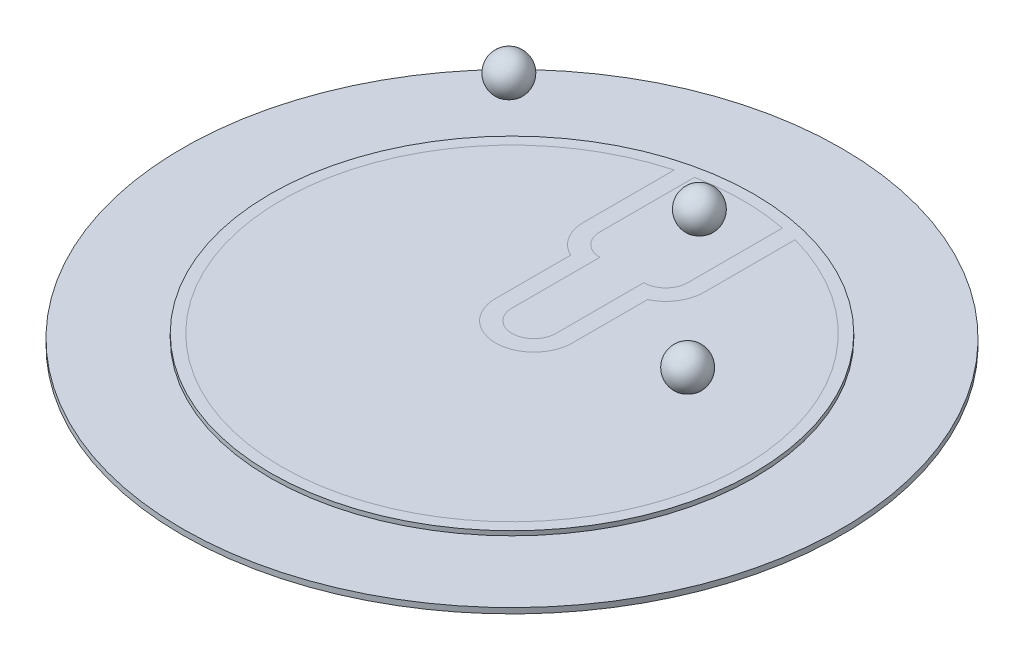
ISO-10303-21;
HEADER;
FILE_DESCRIPTION(('STEP AP214'),'2;1');
FILE_NAME('part.step','',(''),(''),'','','');
FILE_SCHEMA(('AUTOMOTIVE_DESIGN { 1 0 10303 214 1 1 1 1 }'));
ENDSEC;
DATA;
#1=APPLICATION_CONTEXT('core data for automotive mechanical design processes');
#2=APPLICATION_PROTOCOL_DEFINITION('international standard','automotive_design',2000,#1);
#3=PRODUCT_CONTEXT('',#1,'mechanical');
#4=PRODUCT('Part','Part','',(#3));
#5=PRODUCT_RELATED_PRODUCT_CATEGORY('part','',(#4));
#6=PRODUCT_DEFINITION_FORMATION('','',#4);
#7=PRODUCT_DEFINITION_CONTEXT('part definition',#1,'design');
#8=PRODUCT_DEFINITION('design','',#6,#7);
#9=PRODUCT_DEFINITION_SHAPE('','',#8);
#10=(LENGTH_UNIT() NAMED_UNIT(*) SI_UNIT(.MILLI.,.METRE.));
#11=(NAMED_UNIT(*) PLANE_ANGLE_UNIT() SI_UNIT($,.RADIAN.));
#12=(NAMED_UNIT(*) SI_UNIT($,.STERADIAN.) SOLID_ANGLE_UNIT());
#13=UNCERTAINTY_MEASURE_WITH_UNIT(LENGTH_MEASURE(1.E-05),#10,'distance_accuracy_value','');
#14=(GEOMETRIC_REPRESENTATION_CONTEXT(3) GLOBAL_UNCERTAINTY_ASSIGNED_CONTEXT((#13)) GLOBAL_UNIT_ASSIGNED_CONTEXT((#10,
#11,#12)) REPRESENTATION_CONTEXT('',''));
#15=CARTESIAN_POINT('',(0.,0.,0.));
#16=DIRECTION('',(0.,0.,1.));
#17=DIRECTION('',(1.,0.,0.));
#18=AXIS2_PLACEMENT_3D('',#15,#16,#17);
#19=CARTESIAN_POINT('',(5.97028463083582,0.45,-2.02477695580683));
#20=DIRECTION('',(0.,1.,0.));
#21=DIRECTION('',(0.,0.,1.));
#22=AXIS2_PLACEMENT_3D('',#19,#20,#21);
#23=PLANE('',#22);
#24=CARTESIAN_POINT('',(5.97028463083582,0.45,-2.02477695580683));
#25=DIRECTION('',(0.,1.,0.));
#26=DIRECTION('',(0.,0.,1.));
#27=AXIS2_PLACEMENT_3D('',#24,#25,#26);
#28=CIRCLE('',#27,0.6);
#29=CARTESIAN_POINT('',(5.97028463083582,0.45,-1.42477695580683));
#30=VERTEX_POINT('',#29);
#31=EDGE_CURVE('E11',#30,#30,#28,.T.);
#32=ORIENTED_EDGE('',*,*,#31,.F.);
#33=EDGE_LOOP('',(#32));
#34=FACE_BOUND('',#33,.T.);
#35=ADVANCED_FACE('F56',(#34),#23,.F.);
#36=CARTESIAN_POINT('',(5.97028463083582,1.08,-2.02477695580683));
#37=DIRECTION('',(0.,1.,0.));
#38=DIRECTION('',(0.,0.,-1.));
#39=AXIS2_PLACEMENT_3D('',#36,#37,#38);
#40=SPHERICAL_SURFACE('',#39,0.87);
#41=ORIENTED_EDGE('',*,*,#31,.T.);
#42=EDGE_LOOP('',(#41));
#43=FACE_BOUND('',#42,.T.);
#44=ADVANCED_FACE('F63',(#43),#40,.T.);
#45=CLOSED_SHELL('',(#35,#44));
#46=MANIFOLD_SOLID_BREP('B2',#45);
#47=CARTESIAN_POINT('',(0.,0.45,-8.52895660487363));
#48=DIRECTION('',(0.,1.,0.));
#49=DIRECTION('',(0.,0.,1.));
#50=AXIS2_PLACEMENT_3D('',#47,#48,#49);
#51=PLANE('',#50);
#52=CARTESIAN_POINT('',(0.,0.45,-8.52895660487363));
#53=DIRECTION('',(0.,1.,0.));
#54=DIRECTION('',(0.,0.,1.));
#55=AXIS2_PLACEMENT_3D('',#52,#53,#54);
#56=CIRCLE('',#55,0.6);
#57=CARTESIAN_POINT('',(0.,0.45,-7.92895660487363));
#58=VERTEX_POINT('',#57);
#59=EDGE_CURVE('E55',#58,#58,#56,.T.);
#60=ORIENTED_EDGE('',*,*,#59,.F.);
#61=EDGE_LOOP('',(#60));
#62=FACE_BOUND('',#61,.T.);
#63=ADVANCED_FACE('F94',(#62),#51,.F.);
#64=CARTESIAN_POINT('',(0.,1.08,-8.52895660487363));
#65=DIRECTION('',(0.,1.,0.));
#66=DIRECTION('',(0.,0.,-1.));
#67=AXIS2_PLACEMENT_3D('',#64,#65,#66);
#68=SPHERICAL_SURFACE('',#67,0.87);
#69=ORIENTED_EDGE('',*,*,#59,.T.);
#70=EDGE_LOOP('',(#69));
#71=FACE_BOUND('',#70,.T.);
#72=ADVANCED_FACE('F101',(#71),#68,.T.);
#73=CLOSED_SHELL('',(#63,#72));
#74=MANIFOLD_SOLID_BREP('B6',#73);
#75=CARTESIAN_POINT('',(0.,0.45,0.));
#76=DIRECTION('',(0.,1.,0.));
#77=DIRECTION('',(0.,0.,1.));
#78=AXIS2_PLACEMENT_3D('',#75,#76,#77);
#79=PLANE('',#78);
#80=CARTESIAN_POINT('',(0.,0.45,0.));
#81=DIRECTION('',(0.,1.,0.));
#82=DIRECTION('',(0.,0.,1.));
#83=AXIS2_PLACEMENT_3D('',#80,#81,#82);
#84=CIRCLE('',#83,11.);
#85=CARTESIAN_POINT('',(0.,0.45,11.));
#86=VERTEX_POINT('',#85);
#87=EDGE_CURVE('E331',#86,#86,#84,.T.);
#88=ORIENTED_EDGE('',*,*,#87,.T.);
#89=EDGE_LOOP('',(#88));
#90=FACE_BOUND('',#89,.T.);
#91=DIRECTION('',(0.,0.,-1.));
#92=VECTOR('',#91,1.);
#93=CARTESIAN_POINT('',(-2.,0.45,0.));
#94=LINE('',#93,#92);
#95=CARTESIAN_POINT('',(-2.,0.45,-6.));
#96=VERTEX_POINT('',#95);
#97=CARTESIAN_POINT('',(-2.,0.45,-10.3077640640442));
#98=VERTEX_POINT('',#97);
#99=EDGE_CURVE('E217',#96,#98,#94,.T.);
#100=ORIENTED_EDGE('',*,*,#99,.T.);
#101=CARTESIAN_POINT('',(0.,0.45,0.));
#102=DIRECTION('',(0.,1.,0.));
#103=DIRECTION('',(0.,0.,1.));
#104=AXIS2_PLACEMENT_3D('',#101,#102,#103);
#105=CIRCLE('',#104,10.5);
#106=CARTESIAN_POINT('',(2.,0.45,-10.3077640640442));
#107=VERTEX_POINT('',#106);
#108=EDGE_CURVE('E211',#98,#107,#105,.F.);
#109=ORIENTED_EDGE('',*,*,#108,.T.);
#110=DIRECTION('',(0.,0.,1.));
#111=VECTOR('',#110,1.);
#112=CARTESIAN_POINT('',(2.,0.45,0.));
#113=LINE('',#112,#111);
#114=CARTESIAN_POINT('',(2.,0.45,-6.));
#115=VERTEX_POINT('',#114);
#116=EDGE_CURVE('E215',#107,#115,#113,.T.);
#117=ORIENTED_EDGE('',*,*,#116,.T.);
#118=CARTESIAN_POINT('',(1.,0.45,-6.));
#119=DIRECTION('',(0.,1.,0.));
#120=DIRECTION('',(0.,0.,1.));
#121=AXIS2_PLACEMENT_3D('',#118,#119,#120);
#122=CIRCLE('',#121,0.999999999999999);
#123=CARTESIAN_POINT('',(1.,0.45,-5.));
#124=VERTEX_POINT('',#123);
#125=EDGE_CURVE('E223',#115,#124,#122,.F.);
#126=ORIENTED_EDGE('',*,*,#125,.T.);
#127=DIRECTION('',(0.,0.,1.));
#128=VECTOR('',#127,1.);
#129=CARTESIAN_POINT('',(0.999999999999999,0.45,0.));
#130=LINE('',#129,#128);
#131=CARTESIAN_POINT('',(0.999999999999999,0.45,-1.));
#132=VERTEX_POINT('',#131);
#133=EDGE_CURVE('E230',#124,#132,#130,.T.);
#134=ORIENTED_EDGE('',*,*,#133,.T.);
#135=CARTESIAN_POINT('',(0.,0.45,-1.));
#136=DIRECTION('',(0.,1.,0.));
#137=DIRECTION('',(0.,0.,1.));
#138=AXIS2_PLACEMENT_3D('',#135,#136,#137);
#139=CIRCLE('',#138,1.);
#140=CARTESIAN_POINT('',(0.,0.45,0.));
#141=VERTEX_POINT('',#140);
#142=EDGE_CURVE('E241',#132,#141,#139,.F.);
#143=ORIENTED_EDGE('',*,*,#142,.T.);
#144=CARTESIAN_POINT('',(0.,0.45,-1.));
#145=DIRECTION('',(0.,1.,0.));
#146=DIRECTION('',(0.,0.,1.));
#147=AXIS2_PLACEMENT_3D('',#144,#145,#146);
#148=CIRCLE('',#147,1.);
#149=CARTESIAN_POINT('',(-1.,0.45,-1.));
#150=VERTEX_POINT('',#149);
#151=EDGE_CURVE('E245',#141,#150,#148,.F.);
#152=ORIENTED_EDGE('',*,*,#151,.T.);
#153=DIRECTION('',(0.,0.,-1.));
#154=VECTOR('',#153,1.);
#155=CARTESIAN_POINT('',(-0.999999999999999,0.45,0.));
#156=LINE('',#155,#154);
#157=CARTESIAN_POINT('',(-1.,0.45,-5.));
#158=VERTEX_POINT('',#157);
#159=EDGE_CURVE('E249',#150,#158,#156,.T.);
#160=ORIENTED_EDGE('',*,*,#159,.T.);
#161=CARTESIAN_POINT('',(-1.,0.45,-6.));
#162=DIRECTION('',(0.,1.,0.));
#163=DIRECTION('',(0.,0.,1.));
#164=AXIS2_PLACEMENT_3D('',#161,#162,#163);
#165=CIRCLE('',#164,0.999999999999999);
#166=EDGE_CURVE('E253',#158,#96,#165,.F.);
#167=ORIENTED_EDGE('',*,*,#166,.T.);
#168=EDGE_LOOP('',(#100,#109,#117,#126,#134,#143,#152,#160,#167));
#169=FACE_BOUND('',#168,.T.);
#170=DIRECTION('',(0.,0.,-1.));
#171=VECTOR('',#170,1.);
#172=CARTESIAN_POINT('',(2.75,0.45,0.));
#173=LINE('',#172,#171);
#174=CARTESIAN_POINT('',(2.75,0.45,-6.));
#175=VERTEX_POINT('',#174);
#176=CARTESIAN_POINT('',(2.75,0.45,-10.1334840997556));
#177=VERTEX_POINT('',#176);
#178=EDGE_CURVE('E149',#175,#177,#173,.T.);
#179=ORIENTED_EDGE('',*,*,#178,.T.);
#180=CARTESIAN_POINT('',(0.,0.45,0.));
#181=DIRECTION('',(0.,1.,0.));
#182=DIRECTION('',(0.,0.,1.));
#183=AXIS2_PLACEMENT_3D('',#180,#181,#182);
#184=CIRCLE('',#183,10.5);
#185=CARTESIAN_POINT('',(-2.75,0.45,-10.1334840997556));
#186=VERTEX_POINT('',#185);
#187=EDGE_CURVE('E133',#177,#186,#184,.F.);
#188=ORIENTED_EDGE('',*,*,#187,.T.);
#189=DIRECTION('',(0.,0.,1.));
#190=VECTOR('',#189,1.);
#191=CARTESIAN_POINT('',(-2.75,0.45,0.));
#192=LINE('',#191,#190);
#193=CARTESIAN_POINT('',(-2.75,0.45,-6.));
#194=VERTEX_POINT('',#193);
#195=EDGE_CURVE('E220',#186,#194,#192,.T.);
#196=ORIENTED_EDGE('',*,*,#195,.T.);
#197=CARTESIAN_POINT('',(-1.,0.45,-6.));
#198=DIRECTION('',(0.,1.,0.));
#199=DIRECTION('',(0.,0.,1.));
#200=AXIS2_PLACEMENT_3D('',#197,#198,#199);
#201=CIRCLE('',#200,1.75);
#202=CARTESIAN_POINT('',(-1.75,0.45,-4.41886116991581));
#203=VERTEX_POINT('',#202);
#204=EDGE_CURVE('E261',#194,#203,#201,.T.);
#205=ORIENTED_EDGE('',*,*,#204,.T.);
#206=DIRECTION('',(0.,0.,1.));
#207=VECTOR('',#206,1.);
#208=CARTESIAN_POINT('',(-1.75,0.45,0.));
#209=LINE('',#208,#207);
#210=CARTESIAN_POINT('',(-1.75,0.45,-1.));
#211=VERTEX_POINT('',#210);
#212=EDGE_CURVE('E265',#203,#211,#209,.T.);
#213=ORIENTED_EDGE('',*,*,#212,.T.);
#214=CARTESIAN_POINT('',(0.,0.45,-1.));
#215=DIRECTION('',(0.,1.,0.));
#216=DIRECTION('',(0.,0.,1.));
#217=AXIS2_PLACEMENT_3D('',#214,#215,#216);
#218=CIRCLE('',#217,1.75);
#219=CARTESIAN_POINT('',(0.,0.45,0.75));
#220=VERTEX_POINT('',#219);
#221=EDGE_CURVE('E269',#211,#220,#218,.T.);
#222=ORIENTED_EDGE('',*,*,#221,.T.);
#223=CARTESIAN_POINT('',(0.,0.45,-1.));
#224=DIRECTION('',(0.,1.,0.));
#225=DIRECTION('',(0.,0.,1.));
#226=AXIS2_PLACEMENT_3D('',#223,#224,#225);
#227=CIRCLE('',#226,1.75);
#228=CARTESIAN_POINT('',(1.75,0.45,-0.999999999999999));
#229=VERTEX_POINT('',#228);
#230=EDGE_CURVE('E273',#220,#229,#227,.T.);
#231=ORIENTED_EDGE('',*,*,#230,.T.);
#232=DIRECTION('',(0.,0.,-1.));
#233=VECTOR('',#232,1.);
#234=CARTESIAN_POINT('',(1.75,0.45,0.));
#235=LINE('',#234,#233);
#236=CARTESIAN_POINT('',(1.75,0.45,-4.41886116991581));
#237=VERTEX_POINT('',#236);
#238=EDGE_CURVE('E277',#229,#237,#235,.T.);
#239=ORIENTED_EDGE('',*,*,#238,.T.);
#240=CARTESIAN_POINT('',(1.,0.45,-6.));
#241=DIRECTION('',(0.,1.,0.));
#242=DIRECTION('',(0.,0.,1.));
#243=AXIS2_PLACEMENT_3D('',#240,#241,#242);
#244=CIRCLE('',#243,1.75);
#245=EDGE_CURVE('E281',#237,#175,#244,.T.);
#246=ORIENTED_EDGE('',*,*,#245,.T.);
#247=EDGE_LOOP('',(#179,#188,#196,#205,#213,#222,#231,#239,#246));
#248=FACE_BOUND('',#247,.T.);
#249=ADVANCED_FACE('F124',(#90,#169,#248),#79,.T.);
#250=ORIENTED_EDGE('',*,*,#187,.F.);
#251=ORIENTED_EDGE('',*,*,#178,.F.);
#252=ORIENTED_EDGE('',*,*,#245,.F.);
#253=ORIENTED_EDGE('',*,*,#238,.F.);
#254=ORIENTED_EDGE('',*,*,#230,.F.);
#255=ORIENTED_EDGE('',*,*,#221,.F.);
#256=ORIENTED_EDGE('',*,*,#212,.F.);
#257=ORIENTED_EDGE('',*,*,#204,.F.);
#258=ORIENTED_EDGE('',*,*,#195,.F.);
#259=EDGE_LOOP('',(#250,#251,#252,#253,#254,#255,#256,#257,#258));
#260=FACE_BOUND('',#259,.T.);
#261=ADVANCED_FACE('F287',(#260),#79,.T.);
#262=CARTESIAN_POINT('',(0.,0.25,0.));
#263=DIRECTION('',(0.,-1.,0.));
#264=DIRECTION('',(0.,0.,-1.));
#265=AXIS2_PLACEMENT_3D('',#262,#263,#264);
#266=CYLINDRICAL_SURFACE('',#265,15.);
#267=CARTESIAN_POINT('',(0.,0.25,0.));
#268=DIRECTION('',(0.,1.,0.));
#269=DIRECTION('',(0.,0.,1.));
#270=AXIS2_PLACEMENT_3D('',#267,#268,#269);
#271=CIRCLE('',#270,15.);
#272=CARTESIAN_POINT('',(0.,0.25,15.));
#273=VERTEX_POINT('',#272);
#274=EDGE_CURVE('E225',#273,#273,#271,.T.);
#275=ORIENTED_EDGE('',*,*,#274,.F.);
#276=EDGE_LOOP('',(#275));
#277=FACE_BOUND('',#276,.T.);
#278=CARTESIAN_POINT('',(0.,0.,0.));
#279=DIRECTION('',(0.,1.,0.));
#280=DIRECTION('',(0.,0.,1.));
#281=AXIS2_PLACEMENT_3D('',#278,#279,#280);
#282=CIRCLE('',#281,15.);
#283=CARTESIAN_POINT('',(0.,0.,15.));
#284=VERTEX_POINT('',#283);
#285=EDGE_CURVE('E234',#284,#284,#282,.T.);
#286=ORIENTED_EDGE('',*,*,#285,.T.);
#287=EDGE_LOOP('',(#286));
#288=FACE_BOUND('',#287,.T.);
#289=ADVANCED_FACE('F126',(#277,#288),#266,.T.);
#290=CARTESIAN_POINT('',(0.,0.25,0.));
#291=DIRECTION('',(0.,1.,0.));
#292=DIRECTION('',(0.,0.,1.));
#293=AXIS2_PLACEMENT_3D('',#290,#291,#292);
#294=PLANE('',#293);
#295=CARTESIAN_POINT('',(-9.90578643012936,0.25,-9.76209011812938));
#296=DIRECTION('',(0.,1.,0.));
#297=DIRECTION('',(0.,0.,1.));
#298=AXIS2_PLACEMENT_3D('',#295,#296,#297);
#299=CIRCLE('',#298,0.600000000000001);
#300=CARTESIAN_POINT('',(-9.90578643012936,0.25,-9.16209011812938));
#301=VERTEX_POINT('',#300);
#302=EDGE_CURVE('E92',#301,#301,#299,.T.);
#303=ORIENTED_EDGE('',*,*,#302,.F.);
#304=EDGE_LOOP('',(#303));
#305=FACE_BOUND('',#304,.T.);
#306=CARTESIAN_POINT('',(0.,0.25,0.));
#307=DIRECTION('',(0.,1.,0.));
#308=DIRECTION('',(0.,0.,1.));
#309=AXIS2_PLACEMENT_3D('',#306,#307,#308);
#310=CIRCLE('',#309,11.);
#311=CARTESIAN_POINT('',(0.,0.25,11.));
#312=VERTEX_POINT('',#311);
#313=EDGE_CURVE('E325',#312,#312,#310,.T.);
#314=ORIENTED_EDGE('',*,*,#313,.F.);
#315=EDGE_LOOP('',(#314));
#316=FACE_BOUND('',#315,.T.);
#317=ORIENTED_EDGE('',*,*,#274,.T.);
#318=EDGE_LOOP('',(#317));
#319=FACE_BOUND('',#318,.T.);
#320=ADVANCED_FACE('F294',(#305,#316,#319),#294,.T.);
#321=CARTESIAN_POINT('',(0.,0.,0.));
#322=DIRECTION('',(0.,1.,0.));
#323=DIRECTION('',(0.,0.,1.));
#324=AXIS2_PLACEMENT_3D('',#321,#322,#323);
#325=PLANE('',#324);
#326=ORIENTED_EDGE('',*,*,#285,.F.);
#327=EDGE_LOOP('',(#326));
#328=FACE_BOUND('',#327,.T.);
#329=ADVANCED_FACE('F307',(#328),#325,.F.);
#330=CARTESIAN_POINT('',(0.,0.45,0.));
#331=DIRECTION('',(0.,-1.,0.));
#332=DIRECTION('',(0.,0.,-1.));
#333=AXIS2_PLACEMENT_3D('',#330,#331,#332);
#334=CYLINDRICAL_SURFACE('',#333,11.);
#335=ORIENTED_EDGE('',*,*,#87,.F.);
#336=EDGE_LOOP('',(#335));
#337=FACE_BOUND('',#336,.T.);
#338=ORIENTED_EDGE('',*,*,#313,.T.);
#339=EDGE_LOOP('',(#338));
#340=FACE_BOUND('',#339,.T.);
#341=ADVANCED_FACE('F301',(#337,#340),#334,.T.);
#342=ORIENTED_EDGE('',*,*,#108,.F.);
#343=ORIENTED_EDGE('',*,*,#99,.F.);
#344=ORIENTED_EDGE('',*,*,#166,.F.);
#345=ORIENTED_EDGE('',*,*,#159,.F.);
#346=ORIENTED_EDGE('',*,*,#151,.F.);
#347=ORIENTED_EDGE('',*,*,#142,.F.);
#348=ORIENTED_EDGE('',*,*,#133,.F.);
#349=ORIENTED_EDGE('',*,*,#125,.F.);
#350=ORIENTED_EDGE('',*,*,#116,.F.);
#351=EDGE_LOOP('',(#342,#343,#344,#345,#346,#347,#348,#349,#350));
#352=FACE_BOUND('',#351,.T.);
#353=ADVANCED_FACE('F222',(#352),#79,.T.);
#354=CARTESIAN_POINT('',(-9.90578643012936,0.88,-9.76209011812938));
#355=DIRECTION('',(0.,-1.,0.));
#356=DIRECTION('',(0.766935763878061,0.,0.641723876823027));
#357=AXIS2_PLACEMENT_3D('',#354,#355,#356);
#358=SPHERICAL_SURFACE('',#357,0.87);
#359=ORIENTED_EDGE('',*,*,#302,.T.);
#360=EDGE_LOOP('',(#359));
#361=FACE_BOUND('',#360,.T.);
#362=ADVANCED_FACE('F300',(#361),#358,.T.);
#363=CLOSED_SHELL('',(#249,#261,#289,#320,#329,#341,#353,#362));
#364=MANIFOLD_SOLID_BREP('B50',#363);
#365=ADVANCED_BREP_SHAPE_REPRESENTATION('',(#18,#46,#74,#364),#14);
#366=SHAPE_DEFINITION_REPRESENTATION(#9,#365);
ENDSEC;
END-ISO-10303-21;
